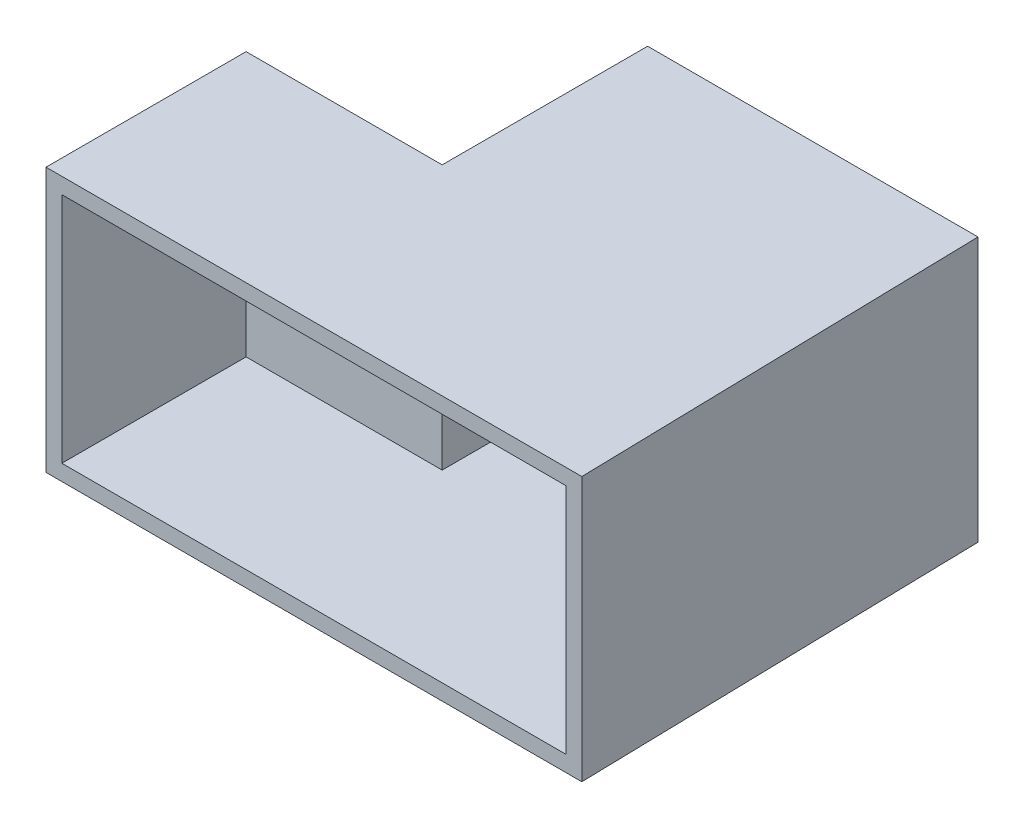
ISO-10303-21;
HEADER;
FILE_DESCRIPTION(('STEP AP214'),'2;1');
FILE_NAME('part.step','',(''),(''),'','','');
FILE_SCHEMA(('AUTOMOTIVE_DESIGN { 1 0 10303 214 1 1 1 1 }'));
ENDSEC;
DATA;
#1=APPLICATION_CONTEXT('core data for automotive mechanical design processes');
#2=APPLICATION_PROTOCOL_DEFINITION('international standard','automotive_design',2000,#1);
#3=PRODUCT_CONTEXT('',#1,'mechanical');
#4=PRODUCT('Part','Part','',(#3));
#5=PRODUCT_RELATED_PRODUCT_CATEGORY('part','',(#4));
#6=PRODUCT_DEFINITION_FORMATION('','',#4);
#7=PRODUCT_DEFINITION_CONTEXT('part definition',#1,'design');
#8=PRODUCT_DEFINITION('design','',#6,#7);
#9=PRODUCT_DEFINITION_SHAPE('','',#8);
#10=(LENGTH_UNIT() NAMED_UNIT(*) SI_UNIT(.MILLI.,.METRE.));
#11=(NAMED_UNIT(*) PLANE_ANGLE_UNIT() SI_UNIT($,.RADIAN.));
#12=(NAMED_UNIT(*) SI_UNIT($,.STERADIAN.) SOLID_ANGLE_UNIT());
#13=UNCERTAINTY_MEASURE_WITH_UNIT(LENGTH_MEASURE(1.E-05),#10,'distance_accuracy_value','');
#14=(GEOMETRIC_REPRESENTATION_CONTEXT(3) GLOBAL_UNCERTAINTY_ASSIGNED_CONTEXT((#13)) GLOBAL_UNIT_ASSIGNED_CONTEXT((#10,
#11,#12)) REPRESENTATION_CONTEXT('',''));
#15=CARTESIAN_POINT('',(0.,0.,0.));
#16=DIRECTION('',(0.,0.,1.));
#17=DIRECTION('',(1.,0.,0.));
#18=AXIS2_PLACEMENT_3D('',#15,#16,#17);
#19=CARTESIAN_POINT('',(-62.103,50.,63.754));
#20=DIRECTION('',(0.,0.,-1.));
#21=DIRECTION('',(-1.,0.,0.));
#22=AXIS2_PLACEMENT_3D('',#19,#20,#21);
#23=PLANE('',#22);
#24=DIRECTION('',(1.,0.,0.));
#25=VECTOR('',#24,1.);
#26=CARTESIAN_POINT('',(-62.103,0.,63.754));
#27=LINE('',#26,#25);
#28=CARTESIAN_POINT('',(-62.103,0.,63.754));
#29=VERTEX_POINT('',#28);
#30=CARTESIAN_POINT('',(39.243,0.,63.754));
#31=VERTEX_POINT('',#30);
#32=EDGE_CURVE('E154',#29,#31,#27,.T.);
#33=ORIENTED_EDGE('',*,*,#32,.T.);
#34=DIRECTION('',(0.,-1.,0.));
#35=VECTOR('',#34,1.);
#36=CARTESIAN_POINT('',(39.243,50.,63.754));
#37=LINE('',#36,#35);
#38=CARTESIAN_POINT('',(39.243,50.,63.754));
#39=VERTEX_POINT('',#38);
#40=EDGE_CURVE('E131',#39,#31,#37,.T.);
#41=ORIENTED_EDGE('',*,*,#40,.F.);
#42=DIRECTION('',(1.,0.,0.));
#43=VECTOR('',#42,1.);
#44=CARTESIAN_POINT('',(-62.103,50.,63.754));
#45=LINE('',#44,#43);
#46=CARTESIAN_POINT('',(-62.103,50.,63.754));
#47=VERTEX_POINT('',#46);
#48=EDGE_CURVE('E113',#47,#39,#45,.T.);
#49=ORIENTED_EDGE('',*,*,#48,.F.);
#50=DIRECTION('',(0.,-1.,0.));
#51=VECTOR('',#50,1.);
#52=CARTESIAN_POINT('',(-62.103,50.,63.754));
#53=LINE('',#52,#51);
#54=EDGE_CURVE('E123',#47,#29,#53,.T.);
#55=ORIENTED_EDGE('',*,*,#54,.T.);
#56=EDGE_LOOP('',(#33,#41,#49,#55));
#57=FACE_BOUND('',#56,.T.);
#58=DIRECTION('',(1.,0.,0.));
#59=VECTOR('',#58,1.);
#60=CARTESIAN_POINT('',(-62.103,3.,63.754));
#61=LINE('',#60,#59);
#62=CARTESIAN_POINT('',(-59.103,3.,63.754));
#63=VERTEX_POINT('',#62);
#64=CARTESIAN_POINT('',(36.2421942225061,3.,63.754));
#65=VERTEX_POINT('',#64);
#66=EDGE_CURVE('E193',#63,#65,#61,.T.);
#67=ORIENTED_EDGE('',*,*,#66,.F.);
#68=DIRECTION('',(0.,-1.,0.));
#69=VECTOR('',#68,1.);
#70=CARTESIAN_POINT('',(-59.103,50.,63.754));
#71=LINE('',#70,#69);
#72=CARTESIAN_POINT('',(-59.103,47.,63.754));
#73=VERTEX_POINT('',#72);
#74=EDGE_CURVE('E191',#73,#63,#71,.T.);
#75=ORIENTED_EDGE('',*,*,#74,.F.);
#76=DIRECTION('',(1.,0.,0.));
#77=VECTOR('',#76,1.);
#78=CARTESIAN_POINT('',(-62.103,47.,63.754));
#79=LINE('',#78,#77);
#80=CARTESIAN_POINT('',(36.2421942225061,47.,63.754));
#81=VERTEX_POINT('',#80);
#82=EDGE_CURVE('E55',#73,#81,#79,.T.);
#83=ORIENTED_EDGE('',*,*,#82,.T.);
#84=DIRECTION('',(0.,-1.,0.));
#85=VECTOR('',#84,1.);
#86=CARTESIAN_POINT('',(36.2421942225061,50.,63.754));
#87=LINE('',#86,#85);
#88=EDGE_CURVE('E187',#81,#65,#87,.T.);
#89=ORIENTED_EDGE('',*,*,#88,.T.);
#90=EDGE_LOOP('',(#67,#75,#83,#89));
#91=FACE_BOUND('',#90,.T.);
#92=ADVANCED_FACE('F39',(#57,#91),#23,.F.);
#93=CARTESIAN_POINT('',(37.465,50.,-12.954));
#94=DIRECTION('',(0.,0.,1.));
#95=DIRECTION('',(1.,0.,0.));
#96=AXIS2_PLACEMENT_3D('',#93,#94,#95);
#97=PLANE('',#96);
#98=DIRECTION('',(-1.,0.,0.));
#99=VECTOR('',#98,1.);
#100=CARTESIAN_POINT('',(37.465,0.,-12.954));
#101=LINE('',#100,#99);
#102=CARTESIAN_POINT('',(37.465,0.,-12.954));
#103=VERTEX_POINT('',#102);
#104=CARTESIAN_POINT('',(-25.019,0.,-12.954));
#105=VERTEX_POINT('',#104);
#106=EDGE_CURVE('E141',#103,#105,#101,.T.);
#107=ORIENTED_EDGE('',*,*,#106,.T.);
#108=DIRECTION('',(0.,-1.,0.));
#109=VECTOR('',#108,1.);
#110=CARTESIAN_POINT('',(-25.019,50.,-12.954));
#111=LINE('',#110,#109);
#112=CARTESIAN_POINT('',(-25.019,50.,-12.954));
#113=VERTEX_POINT('',#112);
#114=EDGE_CURVE('E11',#113,#105,#111,.T.);
#115=ORIENTED_EDGE('',*,*,#114,.F.);
#116=DIRECTION('',(-1.,0.,0.));
#117=VECTOR('',#116,1.);
#118=CARTESIAN_POINT('',(37.465,50.,-12.954));
#119=LINE('',#118,#117);
#120=CARTESIAN_POINT('',(37.465,50.,-12.954));
#121=VERTEX_POINT('',#120);
#122=EDGE_CURVE('E159',#121,#113,#119,.T.);
#123=ORIENTED_EDGE('',*,*,#122,.F.);
#124=DIRECTION('',(0.,-1.,0.));
#125=VECTOR('',#124,1.);
#126=CARTESIAN_POINT('',(37.465,50.,-12.954));
#127=LINE('',#126,#125);
#128=EDGE_CURVE('E137',#121,#103,#127,.T.);
#129=ORIENTED_EDGE('',*,*,#128,.T.);
#130=EDGE_LOOP('',(#107,#115,#123,#129));
#131=FACE_BOUND('',#130,.T.);
#132=ADVANCED_FACE('F41',(#131),#97,.F.);
#133=CARTESIAN_POINT('',(-25.019,50.,-12.954));
#134=DIRECTION('',(1.,0.,0.));
#135=DIRECTION('',(0.,0.,-1.));
#136=AXIS2_PLACEMENT_3D('',#133,#134,#135);
#137=PLANE('',#136);
#138=DIRECTION('',(0.,0.,1.));
#139=VECTOR('',#138,1.);
#140=CARTESIAN_POINT('',(-25.019,0.,-12.954));
#141=LINE('',#140,#139);
#142=CARTESIAN_POINT('',(-25.019,0.,25.908));
#143=VERTEX_POINT('',#142);
#144=EDGE_CURVE('E145',#105,#143,#141,.T.);
#145=ORIENTED_EDGE('',*,*,#144,.T.);
#146=DIRECTION('',(0.,-1.,0.));
#147=VECTOR('',#146,1.);
#148=CARTESIAN_POINT('',(-25.019,50.,25.908));
#149=LINE('',#148,#147);
#150=CARTESIAN_POINT('',(-25.019,50.,25.908));
#151=VERTEX_POINT('',#150);
#152=EDGE_CURVE('E48',#151,#143,#149,.T.);
#153=ORIENTED_EDGE('',*,*,#152,.F.);
#154=DIRECTION('',(0.,0.,1.));
#155=VECTOR('',#154,1.);
#156=CARTESIAN_POINT('',(-25.019,50.,-12.954));
#157=LINE('',#156,#155);
#158=EDGE_CURVE('E99',#113,#151,#157,.T.);
#159=ORIENTED_EDGE('',*,*,#158,.F.);
#160=ORIENTED_EDGE('',*,*,#114,.T.);
#161=EDGE_LOOP('',(#145,#153,#159,#160));
#162=FACE_BOUND('',#161,.T.);
#163=ADVANCED_FACE('F309',(#162),#137,.F.);
#164=CARTESIAN_POINT('',(-25.019,50.,25.908));
#165=DIRECTION('',(0.,0.,1.));
#166=DIRECTION('',(1.,0.,0.));
#167=AXIS2_PLACEMENT_3D('',#164,#165,#166);
#168=PLANE('',#167);
#169=DIRECTION('',(-1.,0.,0.));
#170=VECTOR('',#169,1.);
#171=CARTESIAN_POINT('',(-25.019,0.,25.908));
#172=LINE('',#171,#170);
#173=CARTESIAN_POINT('',(-62.103,0.,25.908));
#174=VERTEX_POINT('',#173);
#175=EDGE_CURVE('E149',#143,#174,#172,.T.);
#176=ORIENTED_EDGE('',*,*,#175,.T.);
#177=DIRECTION('',(0.,-1.,0.));
#178=VECTOR('',#177,1.);
#179=CARTESIAN_POINT('',(-62.103,50.,25.908));
#180=LINE('',#179,#178);
#181=CARTESIAN_POINT('',(-62.103,50.,25.908));
#182=VERTEX_POINT('',#181);
#183=EDGE_CURVE('E130',#182,#174,#180,.T.);
#184=ORIENTED_EDGE('',*,*,#183,.F.);
#185=DIRECTION('',(-1.,0.,0.));
#186=VECTOR('',#185,1.);
#187=CARTESIAN_POINT('',(-25.019,50.,25.908));
#188=LINE('',#187,#186);
#189=EDGE_CURVE('E116',#151,#182,#188,.T.);
#190=ORIENTED_EDGE('',*,*,#189,.F.);
#191=ORIENTED_EDGE('',*,*,#152,.T.);
#192=EDGE_LOOP('',(#176,#184,#190,#191));
#193=FACE_BOUND('',#192,.T.);
#194=ADVANCED_FACE('F169',(#193),#168,.F.);
#195=CARTESIAN_POINT('',(-62.103,50.,25.908));
#196=DIRECTION('',(1.,0.,0.));
#197=DIRECTION('',(0.,0.,-1.));
#198=AXIS2_PLACEMENT_3D('',#195,#196,#197);
#199=PLANE('',#198);
#200=DIRECTION('',(0.,0.,1.));
#201=VECTOR('',#200,1.);
#202=CARTESIAN_POINT('',(-62.103,0.,25.908));
#203=LINE('',#202,#201);
#204=EDGE_CURVE('E126',#174,#29,#203,.T.);
#205=ORIENTED_EDGE('',*,*,#204,.T.);
#206=ORIENTED_EDGE('',*,*,#54,.F.);
#207=DIRECTION('',(0.,0.,1.));
#208=VECTOR('',#207,1.);
#209=CARTESIAN_POINT('',(-62.103,50.,25.908));
#210=LINE('',#209,#208);
#211=EDGE_CURVE('E109',#182,#47,#210,.T.);
#212=ORIENTED_EDGE('',*,*,#211,.F.);
#213=ORIENTED_EDGE('',*,*,#183,.T.);
#214=EDGE_LOOP('',(#205,#206,#212,#213));
#215=FACE_BOUND('',#214,.T.);
#216=ADVANCED_FACE('F124',(#215),#199,.F.);
#217=CARTESIAN_POINT('',(39.243,50.,63.754));
#218=DIRECTION('',(-0.999731479624601,0.,0.0231725839648087));
#219=DIRECTION('',(0.0231725839648087,0.,0.999731479624601));
#220=AXIS2_PLACEMENT_3D('',#217,#218,#219);
#221=PLANE('',#220);
#222=DIRECTION('',(-0.0231725839648087,0.,-0.999731479624601));
#223=VECTOR('',#222,1.);
#224=CARTESIAN_POINT('',(39.243,0.,63.754));
#225=LINE('',#224,#223);
#226=EDGE_CURVE('E91',#31,#103,#225,.T.);
#227=ORIENTED_EDGE('',*,*,#226,.T.);
#228=ORIENTED_EDGE('',*,*,#128,.F.);
#229=DIRECTION('',(-0.0231725839648087,0.,-0.999731479624601));
#230=VECTOR('',#229,1.);
#231=CARTESIAN_POINT('',(39.243,50.,63.754));
#232=LINE('',#231,#230);
#233=EDGE_CURVE('E64',#39,#121,#232,.T.);
#234=ORIENTED_EDGE('',*,*,#233,.F.);
#235=ORIENTED_EDGE('',*,*,#40,.T.);
#236=EDGE_LOOP('',(#227,#228,#234,#235));
#237=FACE_BOUND('',#236,.T.);
#238=ADVANCED_FACE('F173',(#237),#221,.F.);
#239=CARTESIAN_POINT('',(0.,50.,0.));
#240=DIRECTION('',(0.,1.,0.));
#241=DIRECTION('',(0.,0.,1.));
#242=AXIS2_PLACEMENT_3D('',#239,#240,#241);
#243=PLANE('',#242);
#244=ORIENTED_EDGE('',*,*,#122,.T.);
#245=ORIENTED_EDGE('',*,*,#158,.T.);
#246=ORIENTED_EDGE('',*,*,#189,.T.);
#247=ORIENTED_EDGE('',*,*,#211,.T.);
#248=ORIENTED_EDGE('',*,*,#48,.T.);
#249=ORIENTED_EDGE('',*,*,#233,.T.);
#250=EDGE_LOOP('',(#244,#245,#246,#247,#248,#249));
#251=FACE_BOUND('',#250,.T.);
#252=ADVANCED_FACE('F111',(#251),#243,.T.);
#253=CARTESIAN_POINT('',(0.,0.,0.));
#254=DIRECTION('',(0.,1.,0.));
#255=DIRECTION('',(0.,0.,1.));
#256=AXIS2_PLACEMENT_3D('',#253,#254,#255);
#257=PLANE('',#256);
#258=ORIENTED_EDGE('',*,*,#106,.F.);
#259=ORIENTED_EDGE('',*,*,#226,.F.);
#260=ORIENTED_EDGE('',*,*,#32,.F.);
#261=ORIENTED_EDGE('',*,*,#204,.F.);
#262=ORIENTED_EDGE('',*,*,#175,.F.);
#263=ORIENTED_EDGE('',*,*,#144,.F.);
#264=EDGE_LOOP('',(#258,#259,#260,#261,#262,#263));
#265=FACE_BOUND('',#264,.T.);
#266=ADVANCED_FACE('F172',(#265),#257,.F.);
#267=CARTESIAN_POINT('',(37.465,50.,-9.95400000000002));
#268=DIRECTION('',(0.,0.,1.));
#269=DIRECTION('',(1.,0.,0.));
#270=AXIS2_PLACEMENT_3D('',#267,#268,#269);
#271=PLANE('',#270);
#272=DIRECTION('',(-1.,0.,0.));
#273=VECTOR('',#272,1.);
#274=CARTESIAN_POINT('',(37.465,3.,-9.95400000000002));
#275=LINE('',#274,#273);
#276=CARTESIAN_POINT('',(34.5337306463472,3.,-9.95400000000002));
#277=VERTEX_POINT('',#276);
#278=CARTESIAN_POINT('',(-22.019,3.,-9.95400000000002));
#279=VERTEX_POINT('',#278);
#280=EDGE_CURVE('E238',#277,#279,#275,.T.);
#281=ORIENTED_EDGE('',*,*,#280,.F.);
#282=DIRECTION('',(0.,-1.,0.));
#283=VECTOR('',#282,1.);
#284=CARTESIAN_POINT('',(34.5337306463472,50.,-9.95400000000002));
#285=LINE('',#284,#283);
#286=CARTESIAN_POINT('',(34.5337306463472,47.,-9.95400000000002));
#287=VERTEX_POINT('',#286);
#288=EDGE_CURVE('E192',#287,#277,#285,.T.);
#289=ORIENTED_EDGE('',*,*,#288,.F.);
#290=DIRECTION('',(-1.,0.,0.));
#291=VECTOR('',#290,1.);
#292=CARTESIAN_POINT('',(37.465,47.,-9.95400000000002));
#293=LINE('',#292,#291);
#294=CARTESIAN_POINT('',(-22.019,47.,-9.95400000000002));
#295=VERTEX_POINT('',#294);
#296=EDGE_CURVE('E206',#287,#295,#293,.T.);
#297=ORIENTED_EDGE('',*,*,#296,.T.);
#298=DIRECTION('',(0.,-1.,0.));
#299=VECTOR('',#298,1.);
#300=CARTESIAN_POINT('',(-22.019,50.,-9.95400000000002));
#301=LINE('',#300,#299);
#302=EDGE_CURVE('E146',#295,#279,#301,.T.);
#303=ORIENTED_EDGE('',*,*,#302,.T.);
#304=EDGE_LOOP('',(#281,#289,#297,#303));
#305=FACE_BOUND('',#304,.T.);
#306=ADVANCED_FACE('F261',(#305),#271,.T.);
#307=CARTESIAN_POINT('',(-22.019,50.,-12.954));
#308=DIRECTION('',(1.,0.,0.));
#309=DIRECTION('',(0.,0.,-1.));
#310=AXIS2_PLACEMENT_3D('',#307,#308,#309);
#311=PLANE('',#310);
#312=DIRECTION('',(0.,0.,1.));
#313=VECTOR('',#312,1.);
#314=CARTESIAN_POINT('',(-22.019,3.,-12.954));
#315=LINE('',#314,#313);
#316=CARTESIAN_POINT('',(-22.019,3.,28.908));
#317=VERTEX_POINT('',#316);
#318=EDGE_CURVE('E228',#279,#317,#315,.T.);
#319=ORIENTED_EDGE('',*,*,#318,.F.);
#320=ORIENTED_EDGE('',*,*,#302,.F.);
#321=DIRECTION('',(0.,0.,1.));
#322=VECTOR('',#321,1.);
#323=CARTESIAN_POINT('',(-22.019,47.,-12.954));
#324=LINE('',#323,#322);
#325=CARTESIAN_POINT('',(-22.019,47.,28.908));
#326=VERTEX_POINT('',#325);
#327=EDGE_CURVE('E220',#295,#326,#324,.T.);
#328=ORIENTED_EDGE('',*,*,#327,.T.);
#329=DIRECTION('',(0.,-1.,0.));
#330=VECTOR('',#329,1.);
#331=CARTESIAN_POINT('',(-22.019,50.,28.908));
#332=LINE('',#331,#330);
#333=EDGE_CURVE('E224',#326,#317,#332,.T.);
#334=ORIENTED_EDGE('',*,*,#333,.T.);
#335=EDGE_LOOP('',(#319,#320,#328,#334));
#336=FACE_BOUND('',#335,.T.);
#337=ADVANCED_FACE('F287',(#336),#311,.T.);
#338=CARTESIAN_POINT('',(-25.019,50.,28.908));
#339=DIRECTION('',(0.,0.,1.));
#340=DIRECTION('',(1.,0.,0.));
#341=AXIS2_PLACEMENT_3D('',#338,#339,#340);
#342=PLANE('',#341);
#343=DIRECTION('',(-1.,0.,0.));
#344=VECTOR('',#343,1.);
#345=CARTESIAN_POINT('',(-25.019,3.,28.908));
#346=LINE('',#345,#344);
#347=CARTESIAN_POINT('',(-59.103,3.,28.908));
#348=VERTEX_POINT('',#347);
#349=EDGE_CURVE('E216',#317,#348,#346,.T.);
#350=ORIENTED_EDGE('',*,*,#349,.F.);
#351=ORIENTED_EDGE('',*,*,#333,.F.);
#352=DIRECTION('',(-1.,0.,0.));
#353=VECTOR('',#352,1.);
#354=CARTESIAN_POINT('',(-25.019,47.,28.908));
#355=LINE('',#354,#353);
#356=CARTESIAN_POINT('',(-59.103,47.,28.908));
#357=VERTEX_POINT('',#356);
#358=EDGE_CURVE('E212',#326,#357,#355,.T.);
#359=ORIENTED_EDGE('',*,*,#358,.T.);
#360=DIRECTION('',(0.,-1.,0.));
#361=VECTOR('',#360,1.);
#362=CARTESIAN_POINT('',(-59.103,50.,28.908));
#363=LINE('',#362,#361);
#364=EDGE_CURVE('E202',#357,#348,#363,.T.);
#365=ORIENTED_EDGE('',*,*,#364,.T.);
#366=EDGE_LOOP('',(#350,#351,#359,#365));
#367=FACE_BOUND('',#366,.T.);
#368=ADVANCED_FACE('F288',(#367),#342,.T.);
#369=CARTESIAN_POINT('',(-59.103,50.,25.908));
#370=DIRECTION('',(1.,0.,0.));
#371=DIRECTION('',(0.,0.,-1.));
#372=AXIS2_PLACEMENT_3D('',#369,#370,#371);
#373=PLANE('',#372);
#374=DIRECTION('',(0.,0.,1.));
#375=VECTOR('',#374,1.);
#376=CARTESIAN_POINT('',(-59.103,3.,25.908));
#377=LINE('',#376,#375);
#378=EDGE_CURVE('E198',#348,#63,#377,.T.);
#379=ORIENTED_EDGE('',*,*,#378,.F.);
#380=ORIENTED_EDGE('',*,*,#364,.F.);
#381=DIRECTION('',(0.,0.,1.));
#382=VECTOR('',#381,1.);
#383=CARTESIAN_POINT('',(-59.103,47.,25.908));
#384=LINE('',#383,#382);
#385=EDGE_CURVE('E186',#357,#73,#384,.T.);
#386=ORIENTED_EDGE('',*,*,#385,.T.);
#387=ORIENTED_EDGE('',*,*,#74,.T.);
#388=EDGE_LOOP('',(#379,#380,#386,#387));
#389=FACE_BOUND('',#388,.T.);
#390=ADVANCED_FACE('F292',(#389),#373,.T.);
#391=CARTESIAN_POINT('',(36.2438055611262,50.,63.8235177518944));
#392=DIRECTION('',(-0.999731479624601,0.,0.0231725839648087));
#393=DIRECTION('',(0.0231725839648087,0.,0.999731479624601));
#394=AXIS2_PLACEMENT_3D('',#391,#392,#393);
#395=PLANE('',#394);
#396=DIRECTION('',(-0.0231725839648087,0.,-0.999731479624601));
#397=VECTOR('',#396,1.);
#398=CARTESIAN_POINT('',(36.2438055611262,3.,63.8235177518944));
#399=LINE('',#398,#397);
#400=EDGE_CURVE('E197',#65,#277,#399,.T.);
#401=ORIENTED_EDGE('',*,*,#400,.F.);
#402=ORIENTED_EDGE('',*,*,#88,.F.);
#403=DIRECTION('',(-0.0231725839648087,0.,-0.999731479624601));
#404=VECTOR('',#403,1.);
#405=CARTESIAN_POINT('',(36.2438055611262,47.,63.8235177518944));
#406=LINE('',#405,#404);
#407=EDGE_CURVE('E185',#81,#287,#406,.T.);
#408=ORIENTED_EDGE('',*,*,#407,.T.);
#409=ORIENTED_EDGE('',*,*,#288,.T.);
#410=EDGE_LOOP('',(#401,#402,#408,#409));
#411=FACE_BOUND('',#410,.T.);
#412=ADVANCED_FACE('F295',(#411),#395,.T.);
#413=CARTESIAN_POINT('',(0.,47.,0.));
#414=DIRECTION('',(0.,1.,0.));
#415=DIRECTION('',(0.,0.,1.));
#416=AXIS2_PLACEMENT_3D('',#413,#414,#415);
#417=PLANE('',#416);
#418=ORIENTED_EDGE('',*,*,#296,.F.);
#419=ORIENTED_EDGE('',*,*,#407,.F.);
#420=ORIENTED_EDGE('',*,*,#82,.F.);
#421=ORIENTED_EDGE('',*,*,#385,.F.);
#422=ORIENTED_EDGE('',*,*,#358,.F.);
#423=ORIENTED_EDGE('',*,*,#327,.F.);
#424=EDGE_LOOP('',(#418,#419,#420,#421,#422,#423));
#425=FACE_BOUND('',#424,.T.);
#426=ADVANCED_FACE('F289',(#425),#417,.F.);
#427=CARTESIAN_POINT('',(0.,3.,0.));
#428=DIRECTION('',(0.,1.,0.));
#429=DIRECTION('',(0.,0.,1.));
#430=AXIS2_PLACEMENT_3D('',#427,#428,#429);
#431=PLANE('',#430);
#432=ORIENTED_EDGE('',*,*,#280,.T.);
#433=ORIENTED_EDGE('',*,*,#318,.T.);
#434=ORIENTED_EDGE('',*,*,#349,.T.);
#435=ORIENTED_EDGE('',*,*,#378,.T.);
#436=ORIENTED_EDGE('',*,*,#66,.T.);
#437=ORIENTED_EDGE('',*,*,#400,.T.);
#438=EDGE_LOOP('',(#432,#433,#434,#435,#436,#437));
#439=FACE_BOUND('',#438,.T.);
#440=ADVANCED_FACE('F253',(#439),#431,.T.);
#441=CLOSED_SHELL('',(#92,#132,#163,#194,#216,#238,#252,#266,#306,#337,#368,#390,#412,#426,#440));
#442=MANIFOLD_SOLID_BREP('B2',#441);
#443=ADVANCED_BREP_SHAPE_REPRESENTATION('',(#18,#442),#14);
#444=SHAPE_DEFINITION_REPRESENTATION(#9,#443);
ENDSEC;
END-ISO-10303-21;
